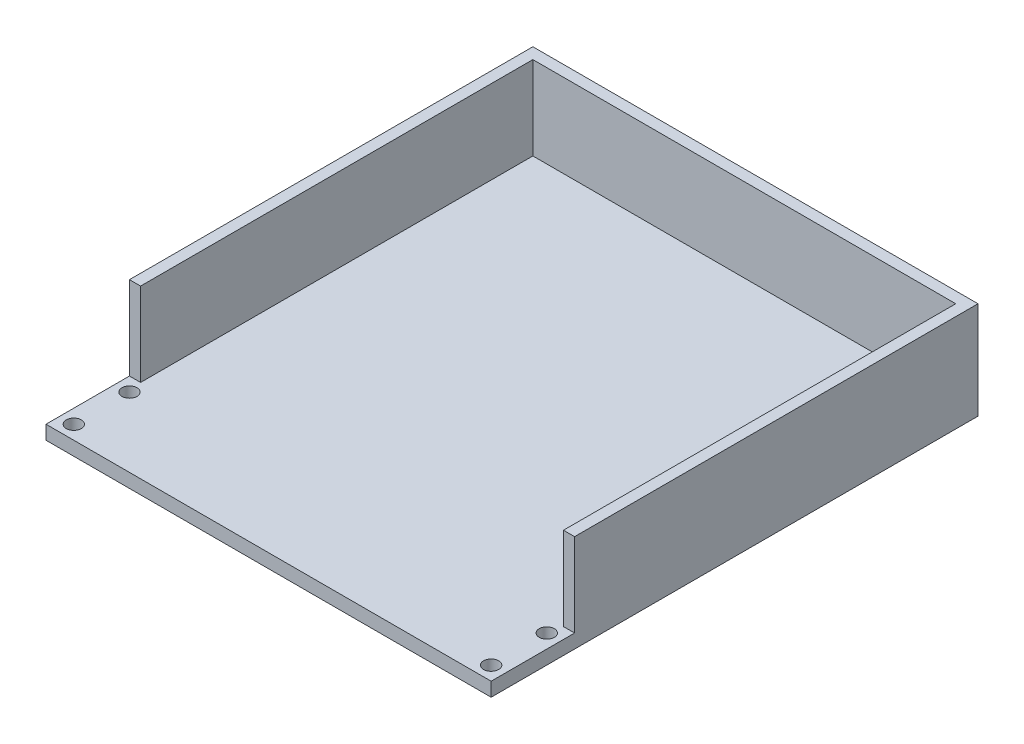
ISO-10303-21;
HEADER;
FILE_DESCRIPTION(('STEP AP214'),'2;1');
FILE_NAME('part.step','',(''),(''),'','','');
FILE_SCHEMA(('AUTOMOTIVE_DESIGN { 1 0 10303 214 1 1 1 1 }'));
ENDSEC;
DATA;
#1=APPLICATION_CONTEXT('core data for automotive mechanical design processes');
#2=APPLICATION_PROTOCOL_DEFINITION('international standard','automotive_design',2000,#1);
#3=PRODUCT_CONTEXT('',#1,'mechanical');
#4=PRODUCT('Part','Part','',(#3));
#5=PRODUCT_RELATED_PRODUCT_CATEGORY('part','',(#4));
#6=PRODUCT_DEFINITION_FORMATION('','',#4);
#7=PRODUCT_DEFINITION_CONTEXT('part definition',#1,'design');
#8=PRODUCT_DEFINITION('design','',#6,#7);
#9=PRODUCT_DEFINITION_SHAPE('','',#8);
#10=(LENGTH_UNIT() NAMED_UNIT(*) SI_UNIT(.MILLI.,.METRE.));
#11=(NAMED_UNIT(*) PLANE_ANGLE_UNIT() SI_UNIT($,.RADIAN.));
#12=(NAMED_UNIT(*) SI_UNIT($,.STERADIAN.) SOLID_ANGLE_UNIT());
#13=UNCERTAINTY_MEASURE_WITH_UNIT(LENGTH_MEASURE(1.E-05),#10,'distance_accuracy_value','');
#14=(GEOMETRIC_REPRESENTATION_CONTEXT(3) GLOBAL_UNCERTAINTY_ASSIGNED_CONTEXT((#13)) GLOBAL_UNIT_ASSIGNED_CONTEXT((#10,
#11,#12)) REPRESENTATION_CONTEXT('',''));
#15=CARTESIAN_POINT('',(0.,0.,0.));
#16=DIRECTION('',(0.,0.,1.));
#17=DIRECTION('',(1.,0.,0.));
#18=AXIS2_PLACEMENT_3D('',#15,#16,#17);
#19=CARTESIAN_POINT('',(50.8,3.175,0.));
#20=DIRECTION('',(-1.,0.,0.));
#21=DIRECTION('',(0.,0.,1.));
#22=AXIS2_PLACEMENT_3D('',#19,#20,#21);
#23=PLANE('',#22);
#24=DIRECTION('',(0.,0.,-1.));
#25=VECTOR('',#24,1.);
#26=CARTESIAN_POINT('',(50.8,0.,0.));
#27=LINE('',#26,#25);
#28=CARTESIAN_POINT('',(50.8,0.,60.325));
#29=VERTEX_POINT('',#28);
#30=CARTESIAN_POINT('',(50.8,0.,-50.8));
#31=VERTEX_POINT('',#30);
#32=EDGE_CURVE('E170',#29,#31,#27,.T.);
#33=ORIENTED_EDGE('',*,*,#32,.T.);
#34=DIRECTION('',(0.,-1.,0.));
#35=VECTOR('',#34,1.);
#36=CARTESIAN_POINT('',(50.8,3.175,-50.8));
#37=LINE('',#36,#35);
#38=CARTESIAN_POINT('',(50.8,22.225,-50.8));
#39=VERTEX_POINT('',#38);
#40=EDGE_CURVE('E47',#39,#31,#37,.T.);
#41=ORIENTED_EDGE('',*,*,#40,.F.);
#42=DIRECTION('',(0.,0.,-1.));
#43=VECTOR('',#42,1.);
#44=CARTESIAN_POINT('',(50.8,22.225,-50.8));
#45=LINE('',#44,#43);
#46=CARTESIAN_POINT('',(50.8,22.225,41.275));
#47=VERTEX_POINT('',#46);
#48=EDGE_CURVE('E239',#47,#39,#45,.T.);
#49=ORIENTED_EDGE('',*,*,#48,.F.);
#50=DIRECTION('',(0.,-1.,0.));
#51=VECTOR('',#50,1.);
#52=CARTESIAN_POINT('',(50.8,22.225,41.275));
#53=LINE('',#52,#51);
#54=CARTESIAN_POINT('',(50.8,3.175,41.275));
#55=VERTEX_POINT('',#54);
#56=EDGE_CURVE('E216',#47,#55,#53,.T.);
#57=ORIENTED_EDGE('',*,*,#56,.T.);
#58=DIRECTION('',(0.,0.,-1.));
#59=VECTOR('',#58,1.);
#60=CARTESIAN_POINT('',(50.8,3.175,0.));
#61=LINE('',#60,#59);
#62=CARTESIAN_POINT('',(50.8,3.175,60.325));
#63=VERTEX_POINT('',#62);
#64=EDGE_CURVE('E173',#63,#55,#61,.T.);
#65=ORIENTED_EDGE('',*,*,#64,.F.);
#66=DIRECTION('',(0.,-1.,0.));
#67=VECTOR('',#66,1.);
#68=CARTESIAN_POINT('',(50.8,3.175,60.325));
#69=LINE('',#68,#67);
#70=EDGE_CURVE('E11',#63,#29,#69,.T.);
#71=ORIENTED_EDGE('',*,*,#70,.T.);
#72=EDGE_LOOP('',(#33,#41,#49,#57,#65,#71));
#73=FACE_BOUND('',#72,.T.);
#74=ADVANCED_FACE('F40',(#73),#23,.F.);
#75=CARTESIAN_POINT('',(0.,3.175,-50.8));
#76=DIRECTION('',(0.,0.,-1.));
#77=DIRECTION('',(-1.,0.,0.));
#78=AXIS2_PLACEMENT_3D('',#75,#76,#77);
#79=PLANE('',#78);
#80=DIRECTION('',(1.,0.,0.));
#81=VECTOR('',#80,1.);
#82=CARTESIAN_POINT('',(0.,0.,-50.8));
#83=LINE('',#82,#81);
#84=CARTESIAN_POINT('',(-50.8,0.,-50.8));
#85=VERTEX_POINT('',#84);
#86=EDGE_CURVE('E180',#85,#31,#83,.T.);
#87=ORIENTED_EDGE('',*,*,#86,.F.);
#88=DIRECTION('',(0.,-1.,0.));
#89=VECTOR('',#88,1.);
#90=CARTESIAN_POINT('',(-50.8,3.175,-50.8));
#91=LINE('',#90,#89);
#92=CARTESIAN_POINT('',(-50.8,22.225,-50.8));
#93=VERTEX_POINT('',#92);
#94=EDGE_CURVE('E188',#93,#85,#91,.T.);
#95=ORIENTED_EDGE('',*,*,#94,.F.);
#96=DIRECTION('',(-1.,0.,0.));
#97=VECTOR('',#96,1.);
#98=CARTESIAN_POINT('',(-50.8,22.225,-50.8));
#99=LINE('',#98,#97);
#100=EDGE_CURVE('E132',#39,#93,#99,.T.);
#101=ORIENTED_EDGE('',*,*,#100,.F.);
#102=ORIENTED_EDGE('',*,*,#40,.T.);
#103=EDGE_LOOP('',(#87,#95,#101,#102));
#104=FACE_BOUND('',#103,.T.);
#105=ADVANCED_FACE('F191',(#104),#79,.T.);
#106=CARTESIAN_POINT('',(-50.8,3.175,0.));
#107=DIRECTION('',(-1.,0.,0.));
#108=DIRECTION('',(0.,0.,1.));
#109=AXIS2_PLACEMENT_3D('',#106,#107,#108);
#110=PLANE('',#109);
#111=DIRECTION('',(0.,0.,-1.));
#112=VECTOR('',#111,1.);
#113=CARTESIAN_POINT('',(-50.8,0.,0.));
#114=LINE('',#113,#112);
#115=CARTESIAN_POINT('',(-50.8,0.,60.325));
#116=VERTEX_POINT('',#115);
#117=EDGE_CURVE('E183',#116,#85,#114,.T.);
#118=ORIENTED_EDGE('',*,*,#117,.F.);
#119=DIRECTION('',(0.,-1.,0.));
#120=VECTOR('',#119,1.);
#121=CARTESIAN_POINT('',(-50.8,3.175,60.325));
#122=LINE('',#121,#120);
#123=CARTESIAN_POINT('',(-50.8,3.175,60.325));
#124=VERTEX_POINT('',#123);
#125=EDGE_CURVE('E177',#124,#116,#122,.T.);
#126=ORIENTED_EDGE('',*,*,#125,.F.);
#127=DIRECTION('',(0.,0.,-1.));
#128=VECTOR('',#127,1.);
#129=CARTESIAN_POINT('',(-50.8,3.175,0.));
#130=LINE('',#129,#128);
#131=CARTESIAN_POINT('',(-50.8,3.175,41.275));
#132=VERTEX_POINT('',#131);
#133=EDGE_CURVE('E140',#124,#132,#130,.T.);
#134=ORIENTED_EDGE('',*,*,#133,.T.);
#135=DIRECTION('',(0.,-1.,0.));
#136=VECTOR('',#135,1.);
#137=CARTESIAN_POINT('',(-50.8,22.225,41.275));
#138=LINE('',#137,#136);
#139=CARTESIAN_POINT('',(-50.8,22.225,41.275));
#140=VERTEX_POINT('',#139);
#141=EDGE_CURVE('E119',#140,#132,#138,.T.);
#142=ORIENTED_EDGE('',*,*,#141,.F.);
#143=DIRECTION('',(0.,0.,1.));
#144=VECTOR('',#143,1.);
#145=CARTESIAN_POINT('',(-50.8,22.225,-50.8));
#146=LINE('',#145,#144);
#147=EDGE_CURVE('E125',#93,#140,#146,.T.);
#148=ORIENTED_EDGE('',*,*,#147,.F.);
#149=ORIENTED_EDGE('',*,*,#94,.T.);
#150=EDGE_LOOP('',(#118,#126,#134,#142,#148,#149));
#151=FACE_BOUND('',#150,.T.);
#152=ADVANCED_FACE('F137',(#151),#110,.T.);
#153=CARTESIAN_POINT('',(0.,3.175,60.3250000000001));
#154=DIRECTION('',(0.,0.,-1.));
#155=DIRECTION('',(-1.,0.,0.));
#156=AXIS2_PLACEMENT_3D('',#153,#154,#155);
#157=PLANE('',#156);
#158=DIRECTION('',(1.,0.,0.));
#159=VECTOR('',#158,1.);
#160=CARTESIAN_POINT('',(0.,0.,60.3250000000001));
#161=LINE('',#160,#159);
#162=EDGE_CURVE('E174',#116,#29,#161,.T.);
#163=ORIENTED_EDGE('',*,*,#162,.T.);
#164=ORIENTED_EDGE('',*,*,#70,.F.);
#165=DIRECTION('',(-1.,0.,0.));
#166=VECTOR('',#165,1.);
#167=CARTESIAN_POINT('',(0.,3.175,60.325));
#168=LINE('',#167,#166);
#169=EDGE_CURVE('E171',#63,#124,#168,.T.);
#170=ORIENTED_EDGE('',*,*,#169,.T.);
#171=ORIENTED_EDGE('',*,*,#125,.T.);
#172=EDGE_LOOP('',(#163,#164,#170,#171));
#173=FACE_BOUND('',#172,.T.);
#174=ADVANCED_FACE('F263',(#173),#157,.F.);
#175=CARTESIAN_POINT('',(0.,3.175,0.));
#176=DIRECTION('',(0.,1.,0.));
#177=DIRECTION('',(0.,0.,1.));
#178=AXIS2_PLACEMENT_3D('',#175,#176,#177);
#179=PLANE('',#178);
#180=ORIENTED_EDGE('',*,*,#133,.F.);
#181=ORIENTED_EDGE('',*,*,#169,.F.);
#182=ORIENTED_EDGE('',*,*,#64,.T.);
#183=DIRECTION('',(1.,0.,0.));
#184=VECTOR('',#183,1.);
#185=CARTESIAN_POINT('',(50.8,3.175,41.275));
#186=LINE('',#185,#184);
#187=CARTESIAN_POINT('',(48.26,3.175,41.275));
#188=VERTEX_POINT('',#187);
#189=EDGE_CURVE('E54',#188,#55,#186,.T.);
#190=ORIENTED_EDGE('',*,*,#189,.F.);
#191=DIRECTION('',(0.,0.,1.));
#192=VECTOR('',#191,1.);
#193=CARTESIAN_POINT('',(48.26,3.175,-48.26));
#194=LINE('',#193,#192);
#195=CARTESIAN_POINT('',(48.26,3.175,-48.26));
#196=VERTEX_POINT('',#195);
#197=EDGE_CURVE('E58',#196,#188,#194,.T.);
#198=ORIENTED_EDGE('',*,*,#197,.F.);
#199=DIRECTION('',(1.,0.,0.));
#200=VECTOR('',#199,1.);
#201=CARTESIAN_POINT('',(-48.26,3.175,-48.26));
#202=LINE('',#201,#200);
#203=CARTESIAN_POINT('',(-48.26,3.175,-48.26));
#204=VERTEX_POINT('',#203);
#205=EDGE_CURVE('E208',#204,#196,#202,.T.);
#206=ORIENTED_EDGE('',*,*,#205,.F.);
#207=DIRECTION('',(0.,0.,-1.));
#208=VECTOR('',#207,1.);
#209=CARTESIAN_POINT('',(-48.26,3.175,41.275));
#210=LINE('',#209,#208);
#211=CARTESIAN_POINT('',(-48.26,3.175,41.275));
#212=VERTEX_POINT('',#211);
#213=EDGE_CURVE('E206',#212,#204,#210,.T.);
#214=ORIENTED_EDGE('',*,*,#213,.F.);
#215=DIRECTION('',(1.,0.,0.));
#216=VECTOR('',#215,1.);
#217=CARTESIAN_POINT('',(-48.26,3.175,41.275));
#218=LINE('',#217,#216);
#219=EDGE_CURVE('E204',#132,#212,#218,.T.);
#220=ORIENTED_EDGE('',*,*,#219,.F.);
#221=EDGE_LOOP('',(#180,#181,#182,#190,#198,#206,#214,#220));
#222=FACE_BOUND('',#221,.T.);
#223=CARTESIAN_POINT('',(47.625,3.175,57.15));
#224=DIRECTION('',(0.,-1.,0.));
#225=DIRECTION('',(0.,0.,-1.));
#226=AXIS2_PLACEMENT_3D('',#223,#224,#225);
#227=CIRCLE('',#226,1.7272);
#228=CARTESIAN_POINT('',(47.625,3.175,55.4228));
#229=VERTEX_POINT('',#228);
#230=EDGE_CURVE('E144',#229,#229,#227,.T.);
#231=ORIENTED_EDGE('',*,*,#230,.T.);
#232=EDGE_LOOP('',(#231));
#233=FACE_BOUND('',#232,.T.);
#234=CARTESIAN_POINT('',(47.625,3.175,44.45));
#235=DIRECTION('',(0.,-1.,0.));
#236=DIRECTION('',(0.,0.,-1.));
#237=AXIS2_PLACEMENT_3D('',#234,#235,#236);
#238=CIRCLE('',#237,1.7272);
#239=CARTESIAN_POINT('',(47.625,3.175,42.7228));
#240=VERTEX_POINT('',#239);
#241=EDGE_CURVE('E155',#240,#240,#238,.T.);
#242=ORIENTED_EDGE('',*,*,#241,.T.);
#243=EDGE_LOOP('',(#242));
#244=FACE_BOUND('',#243,.T.);
#245=CARTESIAN_POINT('',(-47.625,3.175,57.15));
#246=DIRECTION('',(0.,-1.,0.));
#247=DIRECTION('',(0.,0.,-1.));
#248=AXIS2_PLACEMENT_3D('',#245,#246,#247);
#249=CIRCLE('',#248,1.7272);
#250=CARTESIAN_POINT('',(-47.625,3.175,55.4228));
#251=VERTEX_POINT('',#250);
#252=EDGE_CURVE('E161',#251,#251,#249,.T.);
#253=ORIENTED_EDGE('',*,*,#252,.T.);
#254=EDGE_LOOP('',(#253));
#255=FACE_BOUND('',#254,.T.);
#256=CARTESIAN_POINT('',(-47.625,3.175,44.45));
#257=DIRECTION('',(0.,-1.,0.));
#258=DIRECTION('',(0.,0.,-1.));
#259=AXIS2_PLACEMENT_3D('',#256,#257,#258);
#260=CIRCLE('',#259,1.7272);
#261=CARTESIAN_POINT('',(-47.625,3.175,42.7228));
#262=VERTEX_POINT('',#261);
#263=EDGE_CURVE('E167',#262,#262,#260,.T.);
#264=ORIENTED_EDGE('',*,*,#263,.T.);
#265=EDGE_LOOP('',(#264));
#266=FACE_BOUND('',#265,.T.);
#267=ADVANCED_FACE('F202',(#222,#233,#244,#255,#266),#179,.T.);
#268=CARTESIAN_POINT('',(0.,0.,0.));
#269=DIRECTION('',(0.,1.,0.));
#270=DIRECTION('',(0.,0.,1.));
#271=AXIS2_PLACEMENT_3D('',#268,#269,#270);
#272=PLANE('',#271);
#273=ORIENTED_EDGE('',*,*,#32,.F.);
#274=ORIENTED_EDGE('',*,*,#162,.F.);
#275=ORIENTED_EDGE('',*,*,#117,.T.);
#276=ORIENTED_EDGE('',*,*,#86,.T.);
#277=EDGE_LOOP('',(#273,#274,#275,#276));
#278=FACE_BOUND('',#277,.T.);
#279=CARTESIAN_POINT('',(47.625,0.,57.15));
#280=DIRECTION('',(0.,-1.,0.));
#281=DIRECTION('',(0.,0.,-1.));
#282=AXIS2_PLACEMENT_3D('',#279,#280,#281);
#283=CIRCLE('',#282,1.72719999999998);
#284=CARTESIAN_POINT('',(47.625,0.,55.4228));
#285=VERTEX_POINT('',#284);
#286=EDGE_CURVE('E141',#285,#285,#283,.T.);
#287=ORIENTED_EDGE('',*,*,#286,.F.);
#288=EDGE_LOOP('',(#287));
#289=FACE_BOUND('',#288,.T.);
#290=CARTESIAN_POINT('',(47.625,0.,44.45));
#291=DIRECTION('',(0.,-1.,0.));
#292=DIRECTION('',(0.,0.,-1.));
#293=AXIS2_PLACEMENT_3D('',#290,#291,#292);
#294=CIRCLE('',#293,1.72719999999998);
#295=CARTESIAN_POINT('',(47.625,0.,42.7228));
#296=VERTEX_POINT('',#295);
#297=EDGE_CURVE('E152',#296,#296,#294,.T.);
#298=ORIENTED_EDGE('',*,*,#297,.F.);
#299=EDGE_LOOP('',(#298));
#300=FACE_BOUND('',#299,.T.);
#301=CARTESIAN_POINT('',(-47.625,0.,57.15));
#302=DIRECTION('',(0.,-1.,0.));
#303=DIRECTION('',(0.,0.,-1.));
#304=AXIS2_PLACEMENT_3D('',#301,#302,#303);
#305=CIRCLE('',#304,1.72719999999998);
#306=CARTESIAN_POINT('',(-47.625,0.,55.4228));
#307=VERTEX_POINT('',#306);
#308=EDGE_CURVE('E158',#307,#307,#305,.T.);
#309=ORIENTED_EDGE('',*,*,#308,.F.);
#310=EDGE_LOOP('',(#309));
#311=FACE_BOUND('',#310,.T.);
#312=CARTESIAN_POINT('',(-47.625,0.,44.45));
#313=DIRECTION('',(0.,-1.,0.));
#314=DIRECTION('',(0.,0.,-1.));
#315=AXIS2_PLACEMENT_3D('',#312,#313,#314);
#316=CIRCLE('',#315,1.72719999999998);
#317=CARTESIAN_POINT('',(-47.625,0.,42.7228));
#318=VERTEX_POINT('',#317);
#319=EDGE_CURVE('E164',#318,#318,#316,.T.);
#320=ORIENTED_EDGE('',*,*,#319,.F.);
#321=EDGE_LOOP('',(#320));
#322=FACE_BOUND('',#321,.T.);
#323=ADVANCED_FACE('F198',(#278,#289,#300,#311,#322),#272,.F.);
#324=CARTESIAN_POINT('',(-47.625,0.,44.45));
#325=DIRECTION('',(0.,-1.,0.));
#326=DIRECTION('',(0.,0.,-1.));
#327=AXIS2_PLACEMENT_3D('',#324,#325,#326);
#328=CYLINDRICAL_SURFACE('',#327,1.72719999999999);
#329=ORIENTED_EDGE('',*,*,#263,.F.);
#330=EDGE_LOOP('',(#329));
#331=FACE_BOUND('',#330,.T.);
#332=ORIENTED_EDGE('',*,*,#319,.T.);
#333=EDGE_LOOP('',(#332));
#334=FACE_BOUND('',#333,.T.);
#335=ADVANCED_FACE('F270',(#331,#334),#328,.F.);
#336=CARTESIAN_POINT('',(-47.625,0.,57.15));
#337=DIRECTION('',(0.,-1.,0.));
#338=DIRECTION('',(0.,0.,-1.));
#339=AXIS2_PLACEMENT_3D('',#336,#337,#338);
#340=CYLINDRICAL_SURFACE('',#339,1.72719999999999);
#341=ORIENTED_EDGE('',*,*,#252,.F.);
#342=EDGE_LOOP('',(#341));
#343=FACE_BOUND('',#342,.T.);
#344=ORIENTED_EDGE('',*,*,#308,.T.);
#345=EDGE_LOOP('',(#344));
#346=FACE_BOUND('',#345,.T.);
#347=ADVANCED_FACE('F275',(#343,#346),#340,.F.);
#348=CARTESIAN_POINT('',(47.625,0.,44.45));
#349=DIRECTION('',(0.,-1.,0.));
#350=DIRECTION('',(0.,0.,-1.));
#351=AXIS2_PLACEMENT_3D('',#348,#349,#350);
#352=CYLINDRICAL_SURFACE('',#351,1.72719999999999);
#353=ORIENTED_EDGE('',*,*,#241,.F.);
#354=EDGE_LOOP('',(#353));
#355=FACE_BOUND('',#354,.T.);
#356=ORIENTED_EDGE('',*,*,#297,.T.);
#357=EDGE_LOOP('',(#356));
#358=FACE_BOUND('',#357,.T.);
#359=ADVANCED_FACE('F279',(#355,#358),#352,.F.);
#360=CARTESIAN_POINT('',(47.625,0.,57.15));
#361=DIRECTION('',(0.,-1.,0.));
#362=DIRECTION('',(0.,0.,-1.));
#363=AXIS2_PLACEMENT_3D('',#360,#361,#362);
#364=CYLINDRICAL_SURFACE('',#363,1.72719999999999);
#365=ORIENTED_EDGE('',*,*,#230,.F.);
#366=EDGE_LOOP('',(#365));
#367=FACE_BOUND('',#366,.T.);
#368=ORIENTED_EDGE('',*,*,#286,.T.);
#369=EDGE_LOOP('',(#368));
#370=FACE_BOUND('',#369,.T.);
#371=ADVANCED_FACE('F283',(#367,#370),#364,.F.);
#372=CARTESIAN_POINT('',(-48.26,22.225,41.275));
#373=DIRECTION('',(0.,0.,-1.));
#374=DIRECTION('',(-1.,0.,0.));
#375=AXIS2_PLACEMENT_3D('',#372,#373,#374);
#376=PLANE('',#375);
#377=ORIENTED_EDGE('',*,*,#219,.T.);
#378=DIRECTION('',(0.,-1.,0.));
#379=VECTOR('',#378,1.);
#380=CARTESIAN_POINT('',(-48.26,22.225,41.275));
#381=LINE('',#380,#379);
#382=CARTESIAN_POINT('',(-48.26,22.225,41.275));
#383=VERTEX_POINT('',#382);
#384=EDGE_CURVE('E121',#383,#212,#381,.T.);
#385=ORIENTED_EDGE('',*,*,#384,.F.);
#386=DIRECTION('',(1.,0.,0.));
#387=VECTOR('',#386,1.);
#388=CARTESIAN_POINT('',(-48.26,22.225,41.275));
#389=LINE('',#388,#387);
#390=EDGE_CURVE('E114',#140,#383,#389,.T.);
#391=ORIENTED_EDGE('',*,*,#390,.F.);
#392=ORIENTED_EDGE('',*,*,#141,.T.);
#393=EDGE_LOOP('',(#377,#385,#391,#392));
#394=FACE_BOUND('',#393,.T.);
#395=ADVANCED_FACE('F117',(#394),#376,.F.);
#396=CARTESIAN_POINT('',(-48.26,22.225,41.275));
#397=DIRECTION('',(-1.,0.,0.));
#398=DIRECTION('',(0.,0.,1.));
#399=AXIS2_PLACEMENT_3D('',#396,#397,#398);
#400=PLANE('',#399);
#401=ORIENTED_EDGE('',*,*,#213,.T.);
#402=DIRECTION('',(0.,-1.,0.));
#403=VECTOR('',#402,1.);
#404=CARTESIAN_POINT('',(-48.26,22.225,-48.26));
#405=LINE('',#404,#403);
#406=CARTESIAN_POINT('',(-48.26,22.225,-48.26));
#407=VERTEX_POINT('',#406);
#408=EDGE_CURVE('E146',#407,#204,#405,.T.);
#409=ORIENTED_EDGE('',*,*,#408,.F.);
#410=DIRECTION('',(0.,0.,-1.));
#411=VECTOR('',#410,1.);
#412=CARTESIAN_POINT('',(-48.26,22.225,41.275));
#413=LINE('',#412,#411);
#414=EDGE_CURVE('E124',#383,#407,#413,.T.);
#415=ORIENTED_EDGE('',*,*,#414,.F.);
#416=ORIENTED_EDGE('',*,*,#384,.T.);
#417=EDGE_LOOP('',(#401,#409,#415,#416));
#418=FACE_BOUND('',#417,.T.);
#419=ADVANCED_FACE('F232',(#418),#400,.F.);
#420=CARTESIAN_POINT('',(-48.26,22.225,-48.26));
#421=DIRECTION('',(0.,0.,-1.));
#422=DIRECTION('',(-1.,0.,0.));
#423=AXIS2_PLACEMENT_3D('',#420,#421,#422);
#424=PLANE('',#423);
#425=ORIENTED_EDGE('',*,*,#205,.T.);
#426=DIRECTION('',(0.,-1.,0.));
#427=VECTOR('',#426,1.);
#428=CARTESIAN_POINT('',(48.26,22.225,-48.26));
#429=LINE('',#428,#427);
#430=CARTESIAN_POINT('',(48.26,22.225,-48.26));
#431=VERTEX_POINT('',#430);
#432=EDGE_CURVE('E222',#431,#196,#429,.T.);
#433=ORIENTED_EDGE('',*,*,#432,.F.);
#434=DIRECTION('',(1.,0.,0.));
#435=VECTOR('',#434,1.);
#436=CARTESIAN_POINT('',(-48.26,22.225,-48.26));
#437=LINE('',#436,#435);
#438=EDGE_CURVE('E230',#407,#431,#437,.T.);
#439=ORIENTED_EDGE('',*,*,#438,.F.);
#440=ORIENTED_EDGE('',*,*,#408,.T.);
#441=EDGE_LOOP('',(#425,#433,#439,#440));
#442=FACE_BOUND('',#441,.T.);
#443=ADVANCED_FACE('F228',(#442),#424,.F.);
#444=CARTESIAN_POINT('',(48.26,22.225,-48.26));
#445=DIRECTION('',(1.,0.,0.));
#446=DIRECTION('',(0.,0.,-1.));
#447=AXIS2_PLACEMENT_3D('',#444,#445,#446);
#448=PLANE('',#447);
#449=ORIENTED_EDGE('',*,*,#197,.T.);
#450=DIRECTION('',(0.,-1.,0.));
#451=VECTOR('',#450,1.);
#452=CARTESIAN_POINT('',(48.26,22.225,41.275));
#453=LINE('',#452,#451);
#454=CARTESIAN_POINT('',(48.26,22.225,41.275));
#455=VERTEX_POINT('',#454);
#456=EDGE_CURVE('E219',#455,#188,#453,.T.);
#457=ORIENTED_EDGE('',*,*,#456,.F.);
#458=DIRECTION('',(0.,0.,1.));
#459=VECTOR('',#458,1.);
#460=CARTESIAN_POINT('',(48.26,22.225,-48.26));
#461=LINE('',#460,#459);
#462=EDGE_CURVE('E234',#431,#455,#461,.T.);
#463=ORIENTED_EDGE('',*,*,#462,.F.);
#464=ORIENTED_EDGE('',*,*,#432,.T.);
#465=EDGE_LOOP('',(#449,#457,#463,#464));
#466=FACE_BOUND('',#465,.T.);
#467=ADVANCED_FACE('F247',(#466),#448,.F.);
#468=CARTESIAN_POINT('',(50.8,22.225,41.275));
#469=DIRECTION('',(0.,0.,-1.));
#470=DIRECTION('',(-1.,0.,0.));
#471=AXIS2_PLACEMENT_3D('',#468,#469,#470);
#472=PLANE('',#471);
#473=ORIENTED_EDGE('',*,*,#189,.T.);
#474=ORIENTED_EDGE('',*,*,#56,.F.);
#475=DIRECTION('',(1.,0.,0.));
#476=VECTOR('',#475,1.);
#477=CARTESIAN_POINT('',(50.8,22.225,41.275));
#478=LINE('',#477,#476);
#479=EDGE_CURVE('E238',#455,#47,#478,.T.);
#480=ORIENTED_EDGE('',*,*,#479,.F.);
#481=ORIENTED_EDGE('',*,*,#456,.T.);
#482=EDGE_LOOP('',(#473,#474,#480,#481));
#483=FACE_BOUND('',#482,.T.);
#484=ADVANCED_FACE('F243',(#483),#472,.F.);
#485=CARTESIAN_POINT('',(0.,22.225,0.));
#486=DIRECTION('',(0.,-1.,0.));
#487=DIRECTION('',(0.,0.,-1.));
#488=AXIS2_PLACEMENT_3D('',#485,#486,#487);
#489=PLANE('',#488);
#490=ORIENTED_EDGE('',*,*,#147,.T.);
#491=ORIENTED_EDGE('',*,*,#390,.T.);
#492=ORIENTED_EDGE('',*,*,#414,.T.);
#493=ORIENTED_EDGE('',*,*,#438,.T.);
#494=ORIENTED_EDGE('',*,*,#462,.T.);
#495=ORIENTED_EDGE('',*,*,#479,.T.);
#496=ORIENTED_EDGE('',*,*,#48,.T.);
#497=ORIENTED_EDGE('',*,*,#100,.T.);
#498=EDGE_LOOP('',(#490,#491,#492,#493,#494,#495,#496,#497));
#499=FACE_BOUND('',#498,.T.);
#500=ADVANCED_FACE('F129',(#499),#489,.F.);
#501=CLOSED_SHELL('',(#74,#105,#152,#174,#267,#323,#335,#347,#359,#371,#395,#419,#443,#467,#484,#500));
#502=MANIFOLD_SOLID_BREP('B2',#501);
#503=ADVANCED_BREP_SHAPE_REPRESENTATION('',(#18,#502),#14);
#504=SHAPE_DEFINITION_REPRESENTATION(#9,#503);
ENDSEC;
END-ISO-10303-21;
